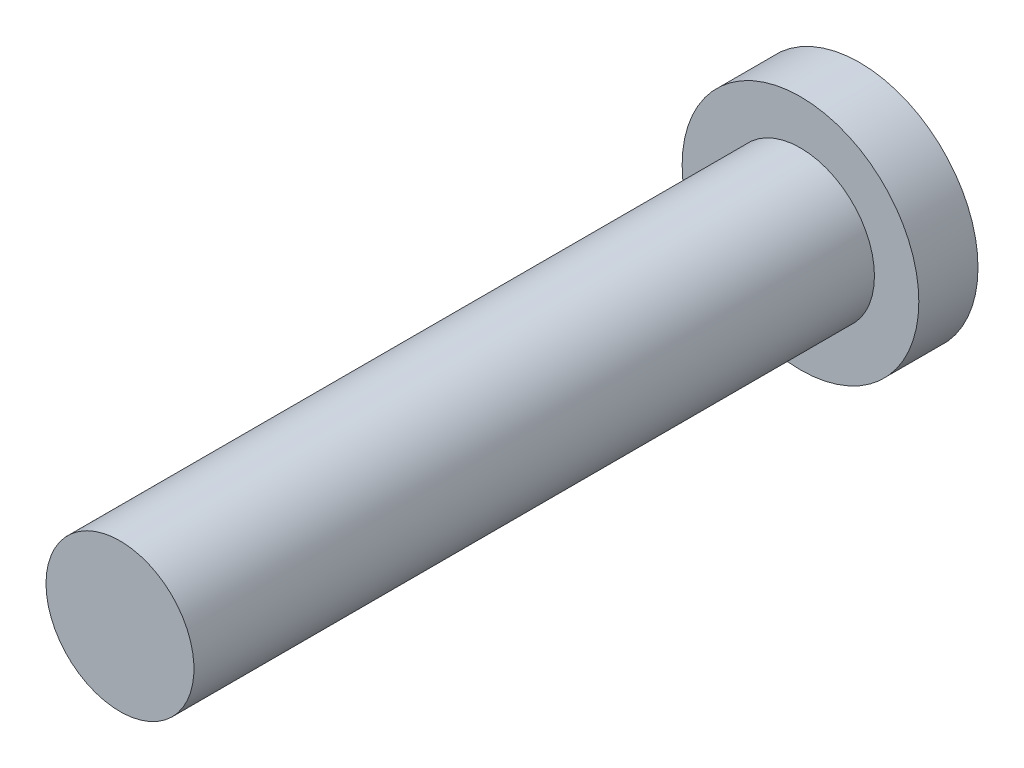
ISO-10303-21;
HEADER;
FILE_DESCRIPTION(('STEP AP214'),'2;1');
FILE_NAME('part.step','',(''),(''),'','','');
FILE_SCHEMA(('AUTOMOTIVE_DESIGN { 1 0 10303 214 1 1 1 1 }'));
ENDSEC;
DATA;
#1=APPLICATION_CONTEXT('core data for automotive mechanical design processes');
#2=APPLICATION_PROTOCOL_DEFINITION('international standard','automotive_design',2000,#1);
#3=PRODUCT_CONTEXT('',#1,'mechanical');
#4=PRODUCT('Part','Part','',(#3));
#5=PRODUCT_RELATED_PRODUCT_CATEGORY('part','',(#4));
#6=PRODUCT_DEFINITION_FORMATION('','',#4);
#7=PRODUCT_DEFINITION_CONTEXT('part definition',#1,'design');
#8=PRODUCT_DEFINITION('design','',#6,#7);
#9=PRODUCT_DEFINITION_SHAPE('','',#8);
#10=(LENGTH_UNIT() NAMED_UNIT(*) SI_UNIT(.MILLI.,.METRE.));
#11=(NAMED_UNIT(*) PLANE_ANGLE_UNIT() SI_UNIT($,.RADIAN.));
#12=(NAMED_UNIT(*) SI_UNIT($,.STERADIAN.) SOLID_ANGLE_UNIT());
#13=UNCERTAINTY_MEASURE_WITH_UNIT(LENGTH_MEASURE(1.E-05),#10,'distance_accuracy_value','');
#14=(GEOMETRIC_REPRESENTATION_CONTEXT(3) GLOBAL_UNCERTAINTY_ASSIGNED_CONTEXT((#13)) GLOBAL_UNIT_ASSIGNED_CONTEXT((#10,
#11,#12)) REPRESENTATION_CONTEXT('',''));
#15=CARTESIAN_POINT('',(0.,0.,0.));
#16=DIRECTION('',(0.,0.,1.));
#17=DIRECTION('',(1.,0.,0.));
#18=AXIS2_PLACEMENT_3D('',#15,#16,#17);
#19=CARTESIAN_POINT('',(0.,0.,2.));
#20=DIRECTION('',(0.,0.,-1.));
#21=DIRECTION('',(-1.,0.,0.));
#22=AXIS2_PLACEMENT_3D('',#19,#20,#21);
#23=CYLINDRICAL_SURFACE('',#22,4.);
#24=CARTESIAN_POINT('',(0.,0.,2.));
#25=DIRECTION('',(0.,0.,1.));
#26=DIRECTION('',(1.,0.,0.));
#27=AXIS2_PLACEMENT_3D('',#24,#25,#26);
#28=CIRCLE('',#27,4.);
#29=CARTESIAN_POINT('',(4.,0.,2.));
#30=VERTEX_POINT('',#29);
#31=EDGE_CURVE('E51',#30,#30,#28,.T.);
#32=ORIENTED_EDGE('',*,*,#31,.F.);
#33=EDGE_LOOP('',(#32));
#34=FACE_BOUND('',#33,.T.);
#35=CARTESIAN_POINT('',(0.,0.,0.));
#36=DIRECTION('',(0.,0.,1.));
#37=DIRECTION('',(1.,0.,0.));
#38=AXIS2_PLACEMENT_3D('',#35,#36,#37);
#39=CIRCLE('',#38,4.);
#40=CARTESIAN_POINT('',(4.,0.,0.));
#41=VERTEX_POINT('',#40);
#42=EDGE_CURVE('E46',#41,#41,#39,.T.);
#43=ORIENTED_EDGE('',*,*,#42,.T.);
#44=EDGE_LOOP('',(#43));
#45=FACE_BOUND('',#44,.T.);
#46=ADVANCED_FACE('F43',(#34,#45),#23,.T.);
#47=CARTESIAN_POINT('',(0.,0.,2.));
#48=DIRECTION('',(0.,0.,1.));
#49=DIRECTION('',(1.,0.,0.));
#50=AXIS2_PLACEMENT_3D('',#47,#48,#49);
#51=PLANE('',#50);
#52=CARTESIAN_POINT('',(0.,0.,2.));
#53=DIRECTION('',(0.,0.,1.));
#54=DIRECTION('',(1.,0.,0.));
#55=AXIS2_PLACEMENT_3D('',#52,#53,#54);
#56=CIRCLE('',#55,2.5);
#57=CARTESIAN_POINT('',(2.5,0.,2.));
#58=VERTEX_POINT('',#57);
#59=EDGE_CURVE('E10',#58,#58,#56,.T.);
#60=ORIENTED_EDGE('',*,*,#59,.F.);
#61=EDGE_LOOP('',(#60));
#62=FACE_BOUND('',#61,.T.);
#63=ORIENTED_EDGE('',*,*,#31,.T.);
#64=EDGE_LOOP('',(#63));
#65=FACE_BOUND('',#64,.T.);
#66=ADVANCED_FACE('F72',(#62,#65),#51,.T.);
#67=CARTESIAN_POINT('',(0.,0.,0.));
#68=DIRECTION('',(0.,0.,1.));
#69=DIRECTION('',(1.,0.,0.));
#70=AXIS2_PLACEMENT_3D('',#67,#68,#69);
#71=PLANE('',#70);
#72=ORIENTED_EDGE('',*,*,#42,.F.);
#73=EDGE_LOOP('',(#72));
#74=FACE_BOUND('',#73,.T.);
#75=ADVANCED_FACE('F68',(#74),#71,.F.);
#76=CARTESIAN_POINT('',(0.,0.,25.));
#77=DIRECTION('',(0.,0.,-1.));
#78=DIRECTION('',(-1.,0.,0.));
#79=AXIS2_PLACEMENT_3D('',#76,#77,#78);
#80=CYLINDRICAL_SURFACE('',#79,2.5);
#81=ORIENTED_EDGE('',*,*,#59,.T.);
#82=EDGE_LOOP('',(#81));
#83=FACE_BOUND('',#82,.T.);
#84=CARTESIAN_POINT('',(0.,0.,25.));
#85=DIRECTION('',(0.,0.,-1.));
#86=DIRECTION('',(-1.,0.,0.));
#87=AXIS2_PLACEMENT_3D('',#84,#85,#86);
#88=CIRCLE('',#87,2.5);
#89=CARTESIAN_POINT('',(-2.5,0.,25.));
#90=VERTEX_POINT('',#89);
#91=EDGE_CURVE('E59',#90,#90,#88,.T.);
#92=ORIENTED_EDGE('',*,*,#91,.T.);
#93=EDGE_LOOP('',(#92));
#94=FACE_BOUND('',#93,.T.);
#95=ADVANCED_FACE('F69',(#83,#94),#80,.T.);
#96=CARTESIAN_POINT('',(0.,0.,25.));
#97=DIRECTION('',(0.,0.,-1.));
#98=DIRECTION('',(-1.,0.,0.));
#99=AXIS2_PLACEMENT_3D('',#96,#97,#98);
#100=PLANE('',#99);
#101=ORIENTED_EDGE('',*,*,#91,.F.);
#102=EDGE_LOOP('',(#101));
#103=FACE_BOUND('',#102,.T.);
#104=ADVANCED_FACE('F77',(#103),#100,.F.);
#105=CLOSED_SHELL('',(#46,#66,#75,#95,#104));
#106=MANIFOLD_SOLID_BREP('B2',#105);
#107=ADVANCED_BREP_SHAPE_REPRESENTATION('',(#18,#106),#14);
#108=SHAPE_DEFINITION_REPRESENTATION(#9,#107);
ENDSEC;
END-ISO-10303-21;
